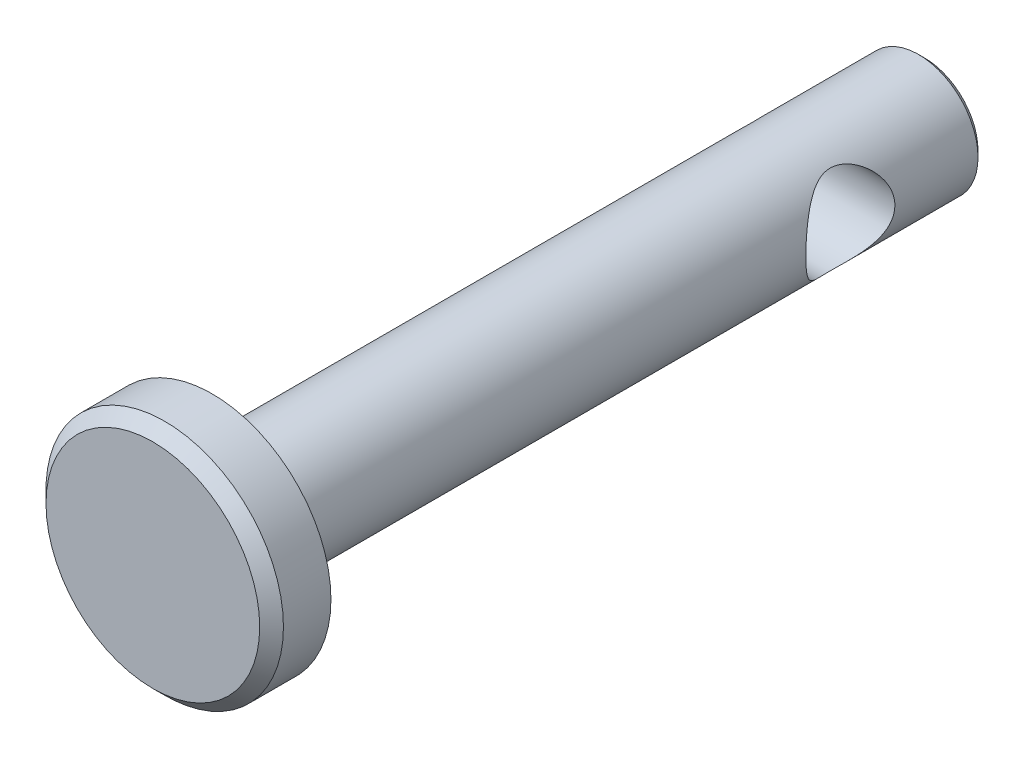
ISO-10303-21;
HEADER;
FILE_DESCRIPTION(('STEP AP214'),'2;1');
FILE_NAME('part.step','',(''),(''),'','','');
FILE_SCHEMA(('AUTOMOTIVE_DESIGN { 1 0 10303 214 1 1 1 1 }'));
ENDSEC;
DATA;
#1=APPLICATION_CONTEXT('core data for automotive mechanical design processes');
#2=APPLICATION_PROTOCOL_DEFINITION('international standard','automotive_design',2000,#1);
#3=PRODUCT_CONTEXT('',#1,'mechanical');
#4=PRODUCT('Part','Part','',(#3));
#5=PRODUCT_RELATED_PRODUCT_CATEGORY('part','',(#4));
#6=PRODUCT_DEFINITION_FORMATION('','',#4);
#7=PRODUCT_DEFINITION_CONTEXT('part definition',#1,'design');
#8=PRODUCT_DEFINITION('design','',#6,#7);
#9=PRODUCT_DEFINITION_SHAPE('','',#8);
#10=(LENGTH_UNIT() NAMED_UNIT(*) SI_UNIT(.MILLI.,.METRE.));
#11=(NAMED_UNIT(*) PLANE_ANGLE_UNIT() SI_UNIT($,.RADIAN.));
#12=(NAMED_UNIT(*) SI_UNIT($,.STERADIAN.) SOLID_ANGLE_UNIT());
#13=UNCERTAINTY_MEASURE_WITH_UNIT(LENGTH_MEASURE(1.E-05),#10,'distance_accuracy_value','');
#14=(GEOMETRIC_REPRESENTATION_CONTEXT(3) GLOBAL_UNCERTAINTY_ASSIGNED_CONTEXT((#13)) GLOBAL_UNIT_ASSIGNED_CONTEXT((#10,
#11,#12)) REPRESENTATION_CONTEXT('',''));
#15=CARTESIAN_POINT('',(0.,0.,0.));
#16=DIRECTION('',(0.,0.,1.));
#17=DIRECTION('',(1.,0.,0.));
#18=AXIS2_PLACEMENT_3D('',#15,#16,#17);
#19=CARTESIAN_POINT('',(0.,0.,9.525));
#20=DIRECTION('',(0.,0.,-1.));
#21=DIRECTION('',(-1.,0.,0.));
#22=AXIS2_PLACEMENT_3D('',#19,#20,#21);
#23=CYLINDRICAL_SURFACE('',#22,1.5875);
#24=CARTESIAN_POINT('',(0.,0.,-9.36624999999997));
#25=DIRECTION('',(0.,0.,1.));
#26=DIRECTION('',(1.,0.,0.));
#27=AXIS2_PLACEMENT_3D('',#24,#25,#26);
#28=CIRCLE('',#27,1.5875);
#29=CARTESIAN_POINT('',(1.5875,0.,-9.36624999999998));
#30=VERTEX_POINT('',#29);
#31=EDGE_CURVE('E39',#30,#30,#28,.T.);
#32=ORIENTED_EDGE('',*,*,#31,.T.);
#33=EDGE_LOOP('',(#32));
#34=FACE_BOUND('',#33,.T.);
#35=CARTESIAN_POINT('',(-1.5875,0.,-4.7625));
#36=CARTESIAN_POINT('',(-1.58749293550487,-0.0581345903619637,-4.76250751736506));
#37=CARTESIAN_POINT('',(-1.5842736454738,-0.116337035476692,-4.76679123415719));
#38=CARTESIAN_POINT('',(-1.57167836349025,-0.230926561501124,-4.78366598301441));
#39=CARTESIAN_POINT('',(-1.56228689316245,-0.287308703602339,-4.79627790062677));
#40=CARTESIAN_POINT('',(-1.53825292604917,-0.396268601409065,-4.82894738700865));
#41=CARTESIAN_POINT('',(-1.5236423654175,-0.448867207249459,-4.84895969767539));
#42=CARTESIAN_POINT('',(-1.49027010950212,-0.549609928884542,-4.89548666443958));
#43=CARTESIAN_POINT('',(-1.47150962872228,-0.597755342103896,-4.92199941838125));
#44=CARTESIAN_POINT('',(-1.42914323984027,-0.693313679409797,-4.98337128717647));
#45=CARTESIAN_POINT('',(-1.40524950621394,-0.740245900404435,-5.01877594851998));
#46=CARTESIAN_POINT('',(-1.35546320984701,-0.827902789635179,-5.09547481503522));
#47=CARTESIAN_POINT('',(-1.32956759006666,-0.868617669733831,-5.13677811276729));
#48=CARTESIAN_POINT('',(-1.27215204210137,-0.951207477538762,-5.2336564712163));
#49=CARTESIAN_POINT('',(-1.24055865999076,-0.991636468498788,-5.29042604425694));
#50=CARTESIAN_POINT('',(-1.1803970925182,-1.06252960824742,-5.41135174052509));
#51=CARTESIAN_POINT('',(-1.15182480849321,-1.0930073780619,-5.47549760312805));
#52=CARTESIAN_POINT('',(-1.11106866917438,-1.13411498357852,-5.58760537827536));
#53=CARTESIAN_POINT('',(-1.09662715003243,-1.14796629108587,-5.63355386586475));
#54=CARTESIAN_POINT('',(-1.0729245285833,-1.17015158839656,-5.72801173321647));
#55=CARTESIAN_POINT('',(-1.06365157402314,-1.17849820935624,-5.77651497243773));
#56=CARTESIAN_POINT('',(-1.0517485925154,-1.18913927577415,-5.87548242726543));
#57=CARTESIAN_POINT('',(-1.04917896183533,-1.19137870417301,-5.92596034031936));
#58=CARTESIAN_POINT('',(-1.05139753338266,-1.18942019258959,-6.02663808553011));
#59=CARTESIAN_POINT('',(-1.05618837351597,-1.18521994470441,-6.07683781151625));
#60=CARTESIAN_POINT('',(-1.07130550994751,-1.17155705567151,-6.16997063193861));
#61=CARTESIAN_POINT('',(-1.08098556023457,-1.16270473579084,-6.21310699425691));
#62=CARTESIAN_POINT('',(-1.10421890680931,-1.14066376466568,-6.29716710972328));
#63=CARTESIAN_POINT('',(-1.11777592426019,-1.12747094551454,-6.33808869200372));
#64=CARTESIAN_POINT('',(-1.15682529319326,-1.08769994678833,-6.44227850704296));
#65=CARTESIAN_POINT('',(-1.18447858988687,-1.05791117864918,-6.50351158075162));
#66=CARTESIAN_POINT('',(-1.24248305418366,-0.989155560080841,-6.61923724078015));
#67=CARTESIAN_POINT('',(-1.2728406637008,-0.950166408786953,-6.67371295052229));
#68=CARTESIAN_POINT('',(-1.33391014894222,-0.862422107554636,-6.77684175364426));
#69=CARTESIAN_POINT('',(-1.36461171965975,-0.813445918236305,-6.82531385671519));
#70=CARTESIAN_POINT('',(-1.42278130148547,-0.706772876608598,-6.91377176962953));
#71=CARTESIAN_POINT('',(-1.45025545184636,-0.649093074346059,-6.95377381168214));
#72=CARTESIAN_POINT('',(-1.49447032570734,-0.538084776360171,-7.01673475939759));
#73=CARTESIAN_POINT('',(-1.51225861937541,-0.486203521959757,-7.04150277165893));
#74=CARTESIAN_POINT('',(-1.54283492881011,-0.378104537479242,-7.08360349886803));
#75=CARTESIAN_POINT('',(-1.55562607581595,-0.32188954946939,-7.10094087055876));
#76=CARTESIAN_POINT('',(-1.57516185979801,-0.206118009533773,-7.12728235679115));
#77=CARTESIAN_POINT('',(-1.58186908171322,-0.146543142115964,-7.13623491703254));
#78=CARTESIAN_POINT('',(-1.58841982654688,-0.0263534840888112,-7.14497999291378));
#79=CARTESIAN_POINT('',(-1.58826624533544,0.0342608569708457,-7.14477637327694));
#80=CARTESIAN_POINT('',(-1.58148771820849,0.14827584750539,-7.13572449751441));
#81=CARTESIAN_POINT('',(-1.57551506239068,0.201788972489742,-7.12774757384462));
#82=CARTESIAN_POINT('',(-1.55853860410011,0.306475344795986,-7.10487706211875));
#83=CARTESIAN_POINT('',(-1.54753373108889,0.357648091683638,-7.08998200230903));
#84=CARTESIAN_POINT('',(-1.5208236560488,0.458324568878753,-7.05335177259172));
#85=CARTESIAN_POINT('',(-1.50496627417841,0.507705655700557,-7.031393749742));
#86=CARTESIAN_POINT('',(-1.46976294670745,0.602074080840441,-6.98168811350594));
#87=CARTESIAN_POINT('',(-1.45041651854828,0.647060810060778,-6.95393969918596));
#88=CARTESIAN_POINT('',(-1.40588322841159,0.739387353390725,-6.88833454816161));
#89=CARTESIAN_POINT('',(-1.38026056676124,0.785865492892055,-6.8495635968215));
#90=CARTESIAN_POINT('',(-1.32745918844359,0.87210880041838,-6.76591805263298));
#91=CARTESIAN_POINT('',(-1.3002771056524,0.911858654352414,-6.72102994461845));
#92=CARTESIAN_POINT('',(-1.24117995581381,0.991215482287606,-6.616581031987));
#93=CARTESIAN_POINT('',(-1.20934732825353,1.02935915896088,-6.55585306056522));
#94=CARTESIAN_POINT('',(-1.15046594382809,1.09476568573709,-6.42670793810963));
#95=CARTESIAN_POINT('',(-1.1234031028437,1.12206087909462,-6.35831443448606));
#96=CARTESIAN_POINT('',(-1.08838109260616,1.15582489066144,-6.24251478120528));
#97=CARTESIAN_POINT('',(-1.07708550635911,1.16626488800437,-6.19728954341626));
#98=CARTESIAN_POINT('',(-1.05999007031602,1.1818264573239,-6.10496378145895));
#99=CARTESIAN_POINT('',(-1.05417795592964,1.18695990066239,-6.05786768898249));
#100=CARTESIAN_POINT('',(-1.04900096423164,1.19154035414093,-5.96278566789294));
#101=CARTESIAN_POINT('',(-1.04966881670936,1.19095849657507,-5.91479644521067));
#102=CARTESIAN_POINT('',(-1.05740556029295,1.18409151553515,-5.81972988426598));
#103=CARTESIAN_POINT('',(-1.06448271154137,1.17779903232889,-5.77265380282681));
#104=CARTESIAN_POINT('',(-1.08598770618424,1.15803236912881,-5.67061780882662));
#105=CARTESIAN_POINT('',(-1.10168297890217,1.14329025684,-5.61618036279258));
#106=CARTESIAN_POINT('',(-1.13810227145169,1.10704016772386,-5.51137546421903));
#107=CARTESIAN_POINT('',(-1.15883896333654,1.08551510031168,-5.46101870093092));
#108=CARTESIAN_POINT('',(-1.21059954092526,1.02789766245492,-5.34787424712875));
#109=CARTESIAN_POINT('',(-1.24269662205451,0.989342211616036,-5.28683410818349));
#110=CARTESIAN_POINT('',(-1.30741347783049,0.902102606381476,-5.17276871231257));
#111=CARTESIAN_POINT('',(-1.34003369413069,0.853409427337065,-5.11975066980209));
#112=CARTESIAN_POINT('',(-1.40278638481485,0.745828937716571,-5.02218968521523));
#113=CARTESIAN_POINT('',(-1.43289615544479,0.686860964920867,-4.9777201466338));
#114=CARTESIAN_POINT('',(-1.48714835544475,0.559720440868611,-4.89964185265253));
#115=CARTESIAN_POINT('',(-1.5113049999054,0.491570429282544,-4.86600716517885));
#116=CARTESIAN_POINT('',(-1.54492918912427,0.368965909789719,-4.81980881542713));
#117=CARTESIAN_POINT('',(-1.55662680105537,0.316348479361362,-4.80395888599979));
#118=CARTESIAN_POINT('',(-1.57466982293622,0.208633970914941,-4.77963205720134));
#119=CARTESIAN_POINT('',(-1.58103017903459,0.153544275563057,-4.77113456638521));
#120=CARTESIAN_POINT('',(-1.58648947610023,0.0654477992947529,-4.76384736125638));
#121=CARTESIAN_POINT('',(-1.58750397790407,0.0327346567825779,-4.76249576709213));
#122=CARTESIAN_POINT('',(-1.5875,0.,-4.7625));
#123=B_SPLINE_CURVE_WITH_KNOTS('',3,(#35,#36,#37,#38,#39,#40,#41,#42,#43,#44,#45,#46,#47,#48,
#49,#50,#51,#52,#53,#54,#55,#56,#57,#58,#59,#60,#61,#62,#63,#64,#65,#66,#67,#68,#69,#70,#71,#72,
#73,#74,#75,#76,#77,#78,#79,#80,#81,#82,#83,#84,#85,#86,#87,#88,#89,#90,#91,#92,#93,#94,#95,#96,
#97,#98,#99,#100,#101,#102,#103,#104,#105,#106,#107,#108,#109,#110,#111,#112,#113,#114,#115,
#116,#117,#118,#119,#120,#121,#122),.UNSPECIFIED.,.T.,.F.,(4,2,2,2,2,2,2,2,2,2,2,2,2,2,2,2,2,2,
2,2,2,2,2,2,2,2,2,2,2,2,2,2,2,2,2,2,2,2,2,2,2,2,2,4),(0.,0.174285105591558,0.349008953542199,
0.522681464773871,0.696303216586626,0.886003048582097,1.07599851796598,1.30460762610664,
1.53290249407352,1.68274617833109,1.83224482098762,1.98308585174373,2.13398095475791,
2.26875094061606,2.40365071711279,2.62294157111712,2.84276952674846,3.06812857866631,
3.29305175845138,3.47286663339593,3.65256865394996,3.83336846160747,4.01409195636146,
4.17664254681542,4.3392277338826,4.50755098830942,4.67589754085445,4.87235803268254,
5.06925983997974,5.3035882307843,5.53721266696799,5.67998896870225,5.82244516787675,
5.96562127487973,6.10898216663331,6.28363988815379,6.45874125070585,6.69458470773788,
6.93063901826044,7.16863763025563,7.40606231082597,7.57392834914441,7.74132272115607,
7.83945987286442),.UNSPECIFIED.);
#124=CARTESIAN_POINT('',(-1.5875,0.,-4.7625));
#125=VERTEX_POINT('',#124);
#126=EDGE_CURVE('E50',#125,#125,#123,.T.);
#127=ORIENTED_EDGE('',*,*,#126,.T.);
#128=EDGE_LOOP('',(#127));
#129=FACE_BOUND('',#128,.T.);
#130=CARTESIAN_POINT('',(1.5875,0.,-7.14375));
#131=CARTESIAN_POINT('',(1.58749293550487,-0.0581345903619637,-7.14374248263494));
#132=CARTESIAN_POINT('',(1.5842736454738,-0.116337035476692,-7.13945876584281));
#133=CARTESIAN_POINT('',(1.57167836349025,-0.230926561501124,-7.12258401698558));
#134=CARTESIAN_POINT('',(1.56228689316245,-0.28730870360234,-7.10997209937323));
#135=CARTESIAN_POINT('',(1.53825292604917,-0.396268601409065,-7.07730261299134));
#136=CARTESIAN_POINT('',(1.5236423654175,-0.44886720724946,-7.0572903023246));
#137=CARTESIAN_POINT('',(1.49027010950211,-0.549609928884544,-7.01076333556042));
#138=CARTESIAN_POINT('',(1.47150962872228,-0.597755342103898,-6.98425058161874));
#139=CARTESIAN_POINT('',(1.42914323984027,-0.693313679409799,-6.92287871282352));
#140=CARTESIAN_POINT('',(1.40524950621394,-0.740245900404436,-6.88747405148001));
#141=CARTESIAN_POINT('',(1.35546320984701,-0.827902789635181,-6.81077518496477));
#142=CARTESIAN_POINT('',(1.32956759006665,-0.868617669733833,-6.7694718872327));
#143=CARTESIAN_POINT('',(1.27215204210136,-0.951207477538763,-6.67259352878369));
#144=CARTESIAN_POINT('',(1.24055865999075,-0.991636468498789,-6.61582395574305));
#145=CARTESIAN_POINT('',(1.1803970925182,-1.06252960824742,-6.4948982594749));
#146=CARTESIAN_POINT('',(1.15182480849321,-1.0930073780619,-6.43075239687195));
#147=CARTESIAN_POINT('',(1.11106866917438,-1.13411498357852,-6.31864462172464));
#148=CARTESIAN_POINT('',(1.09662715003243,-1.14796629108587,-6.27269613413525));
#149=CARTESIAN_POINT('',(1.0729245285833,-1.17015158839656,-6.17823826678352));
#150=CARTESIAN_POINT('',(1.06365157402314,-1.17849820935624,-6.12973502756226));
#151=CARTESIAN_POINT('',(1.0517485925154,-1.18913927577415,-6.03076757273457));
#152=CARTESIAN_POINT('',(1.04917896183533,-1.19137870417301,-5.98028965968064));
#153=CARTESIAN_POINT('',(1.05139753338266,-1.18942019258959,-5.87961191446989));
#154=CARTESIAN_POINT('',(1.05618837351597,-1.18521994470441,-5.82941218848375));
#155=CARTESIAN_POINT('',(1.07130550994751,-1.17155705567151,-5.73627936806139));
#156=CARTESIAN_POINT('',(1.08098556023457,-1.16270473579084,-5.69314300574308));
#157=CARTESIAN_POINT('',(1.10421890680931,-1.14066376466568,-5.60908289027672));
#158=CARTESIAN_POINT('',(1.11777592426019,-1.12747094551454,-5.56816130799628));
#159=CARTESIAN_POINT('',(1.15682529319326,-1.08769994678833,-5.46397149295704));
#160=CARTESIAN_POINT('',(1.18447858988687,-1.05791117864918,-5.40273841924838));
#161=CARTESIAN_POINT('',(1.24248305418366,-0.98915556008084,-5.28701275921985));
#162=CARTESIAN_POINT('',(1.2728406637008,-0.950166408786952,-5.2325370494777));
#163=CARTESIAN_POINT('',(1.33391014894222,-0.862422107554633,-5.12940824635573));
#164=CARTESIAN_POINT('',(1.36461171965975,-0.813445918236302,-5.0809361432848));
#165=CARTESIAN_POINT('',(1.42278130148547,-0.706772876608594,-4.99247823037046));
#166=CARTESIAN_POINT('',(1.45025545184636,-0.649093074346054,-4.95247618831786));
#167=CARTESIAN_POINT('',(1.49447032570734,-0.538084776360165,-4.8895152406024));
#168=CARTESIAN_POINT('',(1.51225861937541,-0.486203521959752,-4.86474722834107));
#169=CARTESIAN_POINT('',(1.54283492881011,-0.378104537479237,-4.82264650113196));
#170=CARTESIAN_POINT('',(1.55562607581595,-0.321889549469385,-4.80530912944123));
#171=CARTESIAN_POINT('',(1.57516185979801,-0.206118009533769,-4.77896764320884));
#172=CARTESIAN_POINT('',(1.58186908171322,-0.14654314211596,-4.77001508296745));
#173=CARTESIAN_POINT('',(1.58841982654688,-0.0263534840888081,-4.76127000708622));
#174=CARTESIAN_POINT('',(1.58826624533544,0.0342608569708485,-4.76147362672305));
#175=CARTESIAN_POINT('',(1.58148771820849,0.148275847505392,-4.77052550248559));
#176=CARTESIAN_POINT('',(1.57551506239068,0.201788972489744,-4.77850242615538));
#177=CARTESIAN_POINT('',(1.55853860410011,0.306475344795987,-4.80137293788124));
#178=CARTESIAN_POINT('',(1.54753373108889,0.357648091683639,-4.81626799769097));
#179=CARTESIAN_POINT('',(1.5208236560488,0.458324568878754,-4.85289822740827));
#180=CARTESIAN_POINT('',(1.50496627417841,0.507705655700558,-4.87485625025799));
#181=CARTESIAN_POINT('',(1.46976294670745,0.602074080840442,-4.92456188649406));
#182=CARTESIAN_POINT('',(1.45041651854828,0.647060810060779,-4.95231030081403));
#183=CARTESIAN_POINT('',(1.40588322841159,0.739387353390726,-5.01791545183839));
#184=CARTESIAN_POINT('',(1.38026056676124,0.785865492892055,-5.05668640317849));
#185=CARTESIAN_POINT('',(1.32745918844359,0.87210880041838,-5.14033194736702));
#186=CARTESIAN_POINT('',(1.3002771056524,0.911858654352414,-5.18522005538154));
#187=CARTESIAN_POINT('',(1.24117995581381,0.991215482287606,-5.28966896801299));
#188=CARTESIAN_POINT('',(1.20934732825353,1.02935915896087,-5.35039693943478));
#189=CARTESIAN_POINT('',(1.15046594382809,1.09476568573709,-5.47954206189037));
#190=CARTESIAN_POINT('',(1.1234031028437,1.12206087909462,-5.54793556551394));
#191=CARTESIAN_POINT('',(1.08838109260616,1.15582489066145,-5.66373521879472));
#192=CARTESIAN_POINT('',(1.07708550635911,1.16626488800437,-5.70896045658374));
#193=CARTESIAN_POINT('',(1.05999007031602,1.1818264573239,-5.80128621854105));
#194=CARTESIAN_POINT('',(1.05417795592964,1.18695990066239,-5.8483823110175));
#195=CARTESIAN_POINT('',(1.04900096423164,1.19154035414093,-5.94346433210706));
#196=CARTESIAN_POINT('',(1.04966881670936,1.19095849657507,-5.99145355478932));
#197=CARTESIAN_POINT('',(1.05740556029295,1.18409151553515,-6.08652011573402));
#198=CARTESIAN_POINT('',(1.06448271154137,1.17779903232889,-6.13359619717319));
#199=CARTESIAN_POINT('',(1.08598770618424,1.15803236912881,-6.23563219117337));
#200=CARTESIAN_POINT('',(1.10168297890217,1.14329025684,-6.29006963720741));
#201=CARTESIAN_POINT('',(1.13810227145168,1.10704016772387,-6.39487453578096));
#202=CARTESIAN_POINT('',(1.15883896333654,1.08551510031168,-6.44523129906907));
#203=CARTESIAN_POINT('',(1.21059954092525,1.02789766245492,-6.55837575287124));
#204=CARTESIAN_POINT('',(1.24269662205451,0.98934221161604,-6.6194158918165));
#205=CARTESIAN_POINT('',(1.30741347783049,0.902102606381482,-6.73348128768742));
#206=CARTESIAN_POINT('',(1.34003369413069,0.853409427337071,-6.78649933019789));
#207=CARTESIAN_POINT('',(1.40278638481485,0.745828937716579,-6.88406031478476));
#208=CARTESIAN_POINT('',(1.43289615544478,0.686860964920875,-6.92852985336619));
#209=CARTESIAN_POINT('',(1.48714835544475,0.559720440868621,-7.00660814734746));
#210=CARTESIAN_POINT('',(1.5113049999054,0.491570429282555,-7.04024283482114));
#211=CARTESIAN_POINT('',(1.54492918912427,0.36896590978973,-7.08644118457286));
#212=CARTESIAN_POINT('',(1.55662680105537,0.316348479361374,-7.1022911140002));
#213=CARTESIAN_POINT('',(1.57466982293622,0.208633970914952,-7.12661794279865));
#214=CARTESIAN_POINT('',(1.58103017903459,0.153544275563068,-7.13511543361479));
#215=CARTESIAN_POINT('',(1.58648947610023,0.06544779929476,-7.14240263874361));
#216=CARTESIAN_POINT('',(1.58750397790407,0.0327346567825815,-7.14375423290787));
#217=CARTESIAN_POINT('',(1.5875,0.,-7.14375));
#218=B_SPLINE_CURVE_WITH_KNOTS('',3,(#130,#131,#132,#133,#134,#135,#136,#137,#138,#139,#140,
#141,#142,#143,#144,#145,#146,#147,#148,#149,#150,#151,#152,#153,#154,#155,#156,#157,#158,#159,
#160,#161,#162,#163,#164,#165,#166,#167,#168,#169,#170,#171,#172,#173,#174,#175,#176,#177,#178,
#179,#180,#181,#182,#183,#184,#185,#186,#187,#188,#189,#190,#191,#192,#193,#194,#195,#196,#197,
#198,#199,#200,#201,#202,#203,#204,#205,#206,#207,#208,#209,#210,#211,#212,#213,#214,#215,#216,
#217),.UNSPECIFIED.,.T.,.F.,(4,2,2,2,2,2,2,2,2,2,2,2,2,2,2,2,2,2,2,2,2,2,2,2,2,2,2,2,2,2,2,2,2,
2,2,2,2,2,2,2,2,2,2,4),(0.,0.174285105591559,0.3490089535422,0.522681464773873,
0.696303216586628,0.8860030485821,1.07599851796598,1.30460762610664,1.53290249407352,
1.68274617833109,1.83224482098762,1.98308585174373,2.13398095475792,2.26875094061606,
2.40365071711279,2.62294157111713,2.84276952674846,3.06812857866631,3.29305175845139,
3.47286663339593,3.65256865394996,3.83336846160748,4.01409195636146,4.17664254681542,
4.3392277338826,4.50755098830943,4.67589754085445,4.87235803268254,5.06925983997974,
5.3035882307843,5.53721266696799,5.67998896870225,5.82244516787675,5.96562127487973,
6.10898216663331,6.28363988815379,6.45874125070584,6.69458470773787,6.93063901826043,
7.16863763025562,7.40606231082595,7.5739283491444,7.74132272115606,7.83945987286442),.UNSPECIFIED.);
#219=CARTESIAN_POINT('',(1.5875,0.,-7.14375));
#220=VERTEX_POINT('',#219);
#221=EDGE_CURVE('E59',#220,#220,#218,.T.);
#222=ORIENTED_EDGE('',*,*,#221,.T.);
#223=EDGE_LOOP('',(#222));
#224=FACE_BOUND('',#223,.T.);
#225=CARTESIAN_POINT('',(0.,0.,9.525));
#226=DIRECTION('',(0.,0.,1.));
#227=DIRECTION('',(1.,0.,0.));
#228=AXIS2_PLACEMENT_3D('',#225,#226,#227);
#229=CIRCLE('',#228,1.5875);
#230=CARTESIAN_POINT('',(1.5875,0.,9.525));
#231=VERTEX_POINT('',#230);
#232=EDGE_CURVE('E98',#231,#231,#229,.T.);
#233=ORIENTED_EDGE('',*,*,#232,.F.);
#234=EDGE_LOOP('',(#233));
#235=FACE_BOUND('',#234,.T.);
#236=ADVANCED_FACE('F32',(#34,#129,#224,#235),#23,.T.);
#237=CARTESIAN_POINT('',(0.,0.,-9.525));
#238=DIRECTION('',(0.,0.,1.));
#239=DIRECTION('',(1.,0.,0.));
#240=AXIS2_PLACEMENT_3D('',#237,#238,#239);
#241=PLANE('',#240);
#242=CARTESIAN_POINT('',(0.,0.,-9.525));
#243=DIRECTION('',(0.,0.,1.));
#244=DIRECTION('',(1.,0.,0.));
#245=AXIS2_PLACEMENT_3D('',#242,#243,#244);
#246=CIRCLE('',#245,1.42874999999998);
#247=CARTESIAN_POINT('',(1.42874999999998,0.,-9.525));
#248=VERTEX_POINT('',#247);
#249=EDGE_CURVE('E10',#248,#248,#246,.F.);
#250=ORIENTED_EDGE('',*,*,#249,.T.);
#251=EDGE_LOOP('',(#250));
#252=FACE_BOUND('',#251,.T.);
#253=ADVANCED_FACE('F80',(#252),#241,.F.);
#254=CARTESIAN_POINT('',(0.,0.,9.525));
#255=DIRECTION('',(0.,0.,1.));
#256=DIRECTION('',(1.,0.,0.));
#257=AXIS2_PLACEMENT_3D('',#254,#255,#256);
#258=PLANE('',#257);
#259=CARTESIAN_POINT('',(0.,0.,9.525));
#260=DIRECTION('',(0.,0.,1.));
#261=DIRECTION('',(1.,0.,0.));
#262=AXIS2_PLACEMENT_3D('',#259,#260,#261);
#263=CIRCLE('',#262,3.175);
#264=CARTESIAN_POINT('',(3.175,0.,9.525));
#265=VERTEX_POINT('',#264);
#266=EDGE_CURVE('E58',#265,#265,#263,.T.);
#267=ORIENTED_EDGE('',*,*,#266,.F.);
#268=EDGE_LOOP('',(#267));
#269=FACE_BOUND('',#268,.T.);
#270=ORIENTED_EDGE('',*,*,#232,.T.);
#271=EDGE_LOOP('',(#270));
#272=FACE_BOUND('',#271,.T.);
#273=ADVANCED_FACE('F77',(#269,#272),#258,.F.);
#274=CARTESIAN_POINT('',(0.,0.,11.1125));
#275=DIRECTION('',(0.,0.,-1.));
#276=DIRECTION('',(-1.,0.,0.));
#277=AXIS2_PLACEMENT_3D('',#274,#275,#276);
#278=CYLINDRICAL_SURFACE('',#277,3.175);
#279=CARTESIAN_POINT('',(0.,0.,10.795));
#280=DIRECTION('',(0.,0.,1.));
#281=DIRECTION('',(1.,0.,0.));
#282=AXIS2_PLACEMENT_3D('',#279,#280,#281);
#283=CIRCLE('',#282,3.175);
#284=CARTESIAN_POINT('',(3.175,0.,10.795));
#285=VERTEX_POINT('',#284);
#286=EDGE_CURVE('E43',#285,#285,#283,.F.);
#287=ORIENTED_EDGE('',*,*,#286,.T.);
#288=EDGE_LOOP('',(#287));
#289=FACE_BOUND('',#288,.T.);
#290=ORIENTED_EDGE('',*,*,#266,.T.);
#291=EDGE_LOOP('',(#290));
#292=FACE_BOUND('',#291,.T.);
#293=ADVANCED_FACE('F75',(#289,#292),#278,.T.);
#294=CARTESIAN_POINT('',(0.,0.,11.1125));
#295=DIRECTION('',(0.,0.,1.));
#296=DIRECTION('',(1.,0.,0.));
#297=AXIS2_PLACEMENT_3D('',#294,#295,#296);
#298=PLANE('',#297);
#299=CARTESIAN_POINT('',(0.,0.,11.1125));
#300=DIRECTION('',(0.,0.,1.));
#301=DIRECTION('',(1.,0.,0.));
#302=AXIS2_PLACEMENT_3D('',#299,#300,#301);
#303=CIRCLE('',#302,2.85749999999999);
#304=CARTESIAN_POINT('',(2.85749999999999,0.,11.1125));
#305=VERTEX_POINT('',#304);
#306=EDGE_CURVE('E47',#305,#305,#303,.T.);
#307=ORIENTED_EDGE('',*,*,#306,.T.);
#308=EDGE_LOOP('',(#307));
#309=FACE_BOUND('',#308,.T.);
#310=ADVANCED_FACE('F71',(#309),#298,.T.);
#311=CARTESIAN_POINT('',(0.,0.,11.1125));
#312=DIRECTION('',(0.,0.,-1.));
#313=DIRECTION('',(-1.,0.,0.));
#314=AXIS2_PLACEMENT_3D('',#311,#312,#313);
#315=CONICAL_SURFACE('',#314,2.85749999999999,0.785398163397448);
#316=ORIENTED_EDGE('',*,*,#286,.F.);
#317=EDGE_LOOP('',(#316));
#318=FACE_BOUND('',#317,.T.);
#319=ORIENTED_EDGE('',*,*,#306,.F.);
#320=EDGE_LOOP('',(#319));
#321=FACE_BOUND('',#320,.T.);
#322=ADVANCED_FACE('F69',(#318,#321),#315,.T.);
#323=CARTESIAN_POINT('',(-3.175,0.,-5.953125));
#324=DIRECTION('',(1.,0.,0.));
#325=DIRECTION('',(0.,0.,-1.));
#326=AXIS2_PLACEMENT_3D('',#323,#324,#325);
#327=CYLINDRICAL_SURFACE('',#326,1.190625);
#328=ORIENTED_EDGE('',*,*,#221,.F.);
#329=EDGE_LOOP('',(#328));
#330=FACE_BOUND('',#329,.T.);
#331=ORIENTED_EDGE('',*,*,#126,.F.);
#332=EDGE_LOOP('',(#331));
#333=FACE_BOUND('',#332,.T.);
#334=ADVANCED_FACE('F65',(#330,#333),#327,.F.);
#335=CARTESIAN_POINT('',(0.,0.,-9.36624999999998));
#336=DIRECTION('',(0.,0.,1.));
#337=DIRECTION('',(1.,0.,0.));
#338=AXIS2_PLACEMENT_3D('',#335,#336,#337);
#339=CONICAL_SURFACE('',#338,1.5875,0.785398163397444);
#340=CARTESIAN_POINT('',(1.42874999999998,0.,-9.525));
#341=CARTESIAN_POINT('',(1.43040364583331,0.,-9.52334635416667));
#342=CARTESIAN_POINT('',(1.43205729166664,0.,-9.52169270833333));
#343=CARTESIAN_POINT('',(1.43536458333331,0.,-9.51838541666667));
#344=CARTESIAN_POINT('',(1.43701822916665,0.,-9.51673177083333));
#345=CARTESIAN_POINT('',(1.44032552083331,0.,-9.51342447916667));
#346=CARTESIAN_POINT('',(1.44197916666665,0.,-9.51177083333333));
#347=CARTESIAN_POINT('',(1.44528645833331,0.,-9.50846354166666));
#348=CARTESIAN_POINT('',(1.44694010416665,0.,-9.50680989583333));
#349=CARTESIAN_POINT('',(1.45024739583331,0.,-9.50350260416666));
#350=CARTESIAN_POINT('',(1.45190104166665,0.,-9.50184895833333));
#351=CARTESIAN_POINT('',(1.45520833333332,0.,-9.49854166666666));
#352=CARTESIAN_POINT('',(1.45686197916665,0.,-9.49688802083333));
#353=CARTESIAN_POINT('',(1.46016927083332,0.,-9.49358072916666));
#354=CARTESIAN_POINT('',(1.46182291666665,0.,-9.49192708333333));
#355=CARTESIAN_POINT('',(1.46513020833332,0.,-9.48861979166666));
#356=CARTESIAN_POINT('',(1.46678385416665,0.,-9.48696614583333));
#357=CARTESIAN_POINT('',(1.47009114583332,0.,-9.48365885416666));
#358=CARTESIAN_POINT('',(1.47174479166665,0.,-9.48200520833333));
#359=CARTESIAN_POINT('',(1.47505208333332,0.,-9.47869791666666));
#360=CARTESIAN_POINT('',(1.47670572916665,0.,-9.47704427083333));
#361=CARTESIAN_POINT('',(1.48001302083332,0.,-9.47373697916666));
#362=CARTESIAN_POINT('',(1.48166666666665,0.,-9.47208333333332));
#363=CARTESIAN_POINT('',(1.48497395833332,0.,-9.46877604166666));
#364=CARTESIAN_POINT('',(1.48662760416665,0.,-9.46712239583332));
#365=CARTESIAN_POINT('',(1.48993489583332,0.,-9.46381510416666));
#366=CARTESIAN_POINT('',(1.49158854166665,0.,-9.46216145833333));
#367=CARTESIAN_POINT('',(1.49489583333332,0.,-9.45885416666666));
#368=CARTESIAN_POINT('',(1.49654947916666,0.,-9.45720052083332));
#369=CARTESIAN_POINT('',(1.49985677083332,0.,-9.45389322916666));
#370=CARTESIAN_POINT('',(1.50151041666666,0.,-9.45223958333332));
#371=CARTESIAN_POINT('',(1.50481770833332,0.,-9.44893229166665));
#372=CARTESIAN_POINT('',(1.50647135416666,0.,-9.44727864583332));
#373=CARTESIAN_POINT('',(1.50977864583332,0.,-9.44397135416665));
#374=CARTESIAN_POINT('',(1.51143229166666,0.,-9.44231770833332));
#375=CARTESIAN_POINT('',(1.51473958333333,0.,-9.43901041666665));
#376=CARTESIAN_POINT('',(1.51639322916666,0.,-9.43735677083332));
#377=CARTESIAN_POINT('',(1.51970052083333,0.,-9.43404947916665));
#378=CARTESIAN_POINT('',(1.52135416666666,0.,-9.43239583333332));
#379=CARTESIAN_POINT('',(1.52466145833333,0.,-9.42908854166665));
#380=CARTESIAN_POINT('',(1.52631510416666,0.,-9.42743489583332));
#381=CARTESIAN_POINT('',(1.52962239583333,0.,-9.42412760416665));
#382=CARTESIAN_POINT('',(1.53127604166666,0.,-9.42247395833332));
#383=CARTESIAN_POINT('',(1.53458333333333,0.,-9.41916666666665));
#384=CARTESIAN_POINT('',(1.53623697916666,0.,-9.41751302083332));
#385=CARTESIAN_POINT('',(1.53954427083333,0.,-9.41420572916665));
#386=CARTESIAN_POINT('',(1.54119791666666,0.,-9.41255208333332));
#387=CARTESIAN_POINT('',(1.54450520833333,0.,-9.40924479166665));
#388=CARTESIAN_POINT('',(1.54615885416666,0.,-9.40759114583331));
#389=CARTESIAN_POINT('',(1.54946614583333,0.,-9.40428385416665));
#390=CARTESIAN_POINT('',(1.55111979166666,0.,-9.40263020833332));
#391=CARTESIAN_POINT('',(1.55442708333333,0.,-9.39932291666665));
#392=CARTESIAN_POINT('',(1.55608072916666,0.,-9.39766927083331));
#393=CARTESIAN_POINT('',(1.55938802083333,0.,-9.39436197916665));
#394=CARTESIAN_POINT('',(1.56104166666667,0.,-9.39270833333331));
#395=CARTESIAN_POINT('',(1.56434895833333,0.,-9.38940104166664));
#396=CARTESIAN_POINT('',(1.56600260416667,0.,-9.38774739583331));
#397=CARTESIAN_POINT('',(1.56930989583333,0.,-9.38444010416664));
#398=CARTESIAN_POINT('',(1.57096354166667,0.,-9.38278645833331));
#399=CARTESIAN_POINT('',(1.57427083333333,0.,-9.37947916666664));
#400=CARTESIAN_POINT('',(1.57592447916667,0.,-9.37782552083331));
#401=CARTESIAN_POINT('',(1.57923177083333,0.,-9.37451822916664));
#402=CARTESIAN_POINT('',(1.58088541666667,0.,-9.37286458333331));
#403=CARTESIAN_POINT('',(1.58419270833334,0.,-9.36955729166664));
#404=CARTESIAN_POINT('',(1.58584635416667,0.,-9.36790364583331));
#405=CARTESIAN_POINT('',(1.5875,0.,-9.36624999999998));
#406=B_SPLINE_CURVE_WITH_KNOTS('',3,(#340,#341,#342,#343,#344,#345,#346,#347,#348,#349,#350,
#351,#352,#353,#354,#355,#356,#357,#358,#359,#360,#361,#362,#363,#364,#365,#366,#367,#368,#369,
#370,#371,#372,#373,#374,#375,#376,#377,#378,#379,#380,#381,#382,#383,#384,#385,#386,#387,#388,
#389,#390,#391,#392,#393,#394,#395,#396,#397,#398,#399,#400,#401,#402,#403,#404,#405),
.UNSPECIFIED.,.F.,.F.,(4,2,2,2,2,2,2,2,2,2,2,2,2,2,2,2,2,2,2,2,2,2,2,2,2,2,2,2,2,2,2,2,4),(0.,
0.00701582509458555,0.0140316501891723,0.0210474752837589,0.0280633003783457,0.0350791254729313,
0.042094950567518,0.0491107756621048,0.0561266007566916,0.063142425851277,0.0701582509458637,
0.0771740760404505,0.0841899011350373,0.0912057262296228,0.0982215513242094,0.105237376418796,
0.112253201513383,0.119269026607969,0.126284851702555,0.133300676797142,0.140316501891729,
0.147332326986314,0.154348152080901,0.161363977175488,0.168379802270074,0.17539562736466,
0.182411452459247,0.189427277553834,0.19644310264842,0.203458927743006,0.210474752837592,
0.217490577932179,0.224506403026765),.UNSPECIFIED.);
#407=EDGE_CURVE('BSEAM34',#248,#30,#406,.T.);
#408=ORIENTED_EDGE('',*,*,#249,.F.);
#409=ORIENTED_EDGE('',*,*,#31,.F.);
#410=ORIENTED_EDGE('',*,*,#407,.T.);
#411=ORIENTED_EDGE('',*,*,#407,.F.);
#412=EDGE_LOOP('',(#408,#410,#409,#411));
#413=FACE_BOUND('',#412,.T.);
#414=ADVANCED_FACE('F34',(#413),#339,.T.);
#415=CLOSED_SHELL('',(#236,#253,#273,#293,#310,#322,#334,#414));
#416=MANIFOLD_SOLID_BREP('B2',#415);
#417=ADVANCED_BREP_SHAPE_REPRESENTATION('',(#18,#416),#14);
#418=SHAPE_DEFINITION_REPRESENTATION(#9,#417);
ENDSEC;
END-ISO-10303-21;
